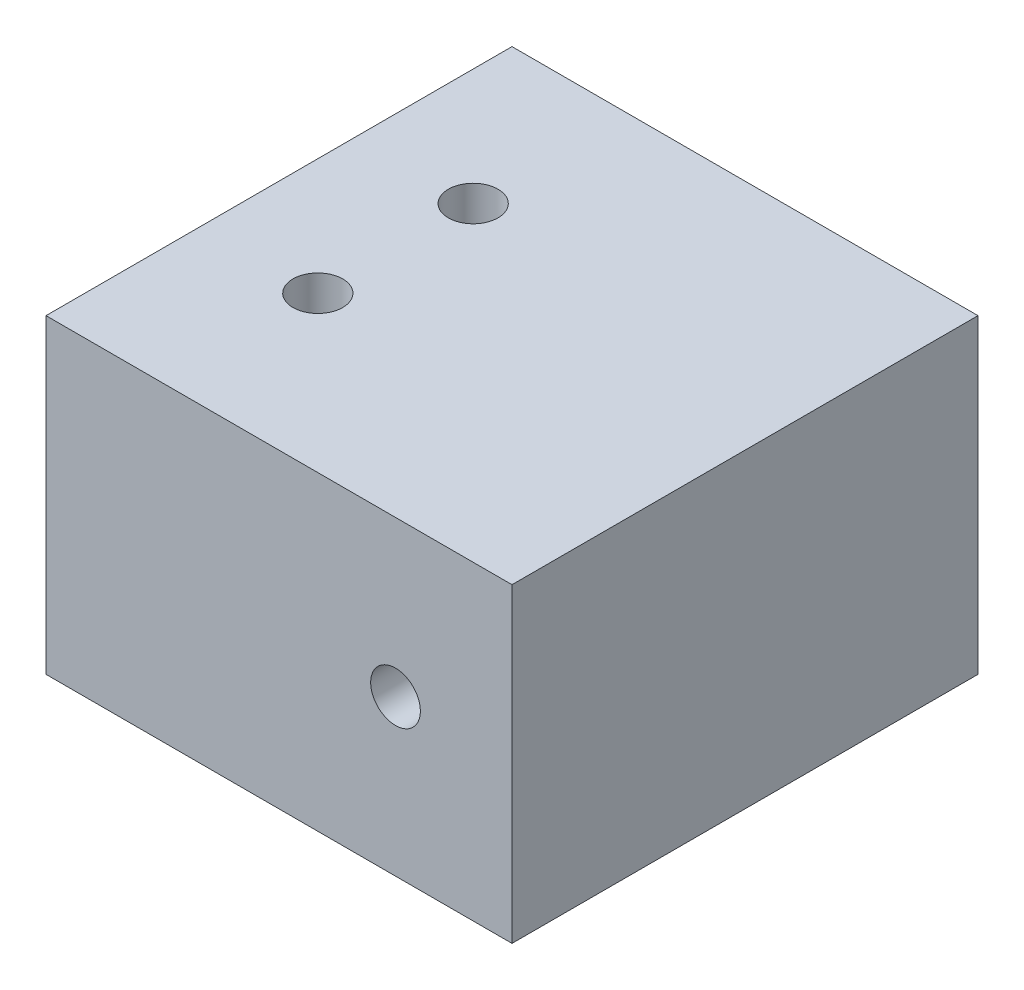
ISO-10303-21;
HEADER;
FILE_DESCRIPTION(('STEP AP214'),'2;1');
FILE_NAME('part.step','',(''),(''),'','','');
FILE_SCHEMA(('AUTOMOTIVE_DESIGN { 1 0 10303 214 1 1 1 1 }'));
ENDSEC;
DATA;
#1=APPLICATION_CONTEXT('core data for automotive mechanical design processes');
#2=APPLICATION_PROTOCOL_DEFINITION('international standard','automotive_design',2000,#1);
#3=PRODUCT_CONTEXT('',#1,'mechanical');
#4=PRODUCT('Part','Part','',(#3));
#5=PRODUCT_RELATED_PRODUCT_CATEGORY('part','',(#4));
#6=PRODUCT_DEFINITION_FORMATION('','',#4);
#7=PRODUCT_DEFINITION_CONTEXT('part definition',#1,'design');
#8=PRODUCT_DEFINITION('design','',#6,#7);
#9=PRODUCT_DEFINITION_SHAPE('','',#8);
#10=(LENGTH_UNIT() NAMED_UNIT(*) SI_UNIT(.MILLI.,.METRE.));
#11=(NAMED_UNIT(*) PLANE_ANGLE_UNIT() SI_UNIT($,.RADIAN.));
#12=(NAMED_UNIT(*) SI_UNIT($,.STERADIAN.) SOLID_ANGLE_UNIT());
#13=UNCERTAINTY_MEASURE_WITH_UNIT(LENGTH_MEASURE(1.E-05),#10,'distance_accuracy_value','');
#14=(GEOMETRIC_REPRESENTATION_CONTEXT(3) GLOBAL_UNCERTAINTY_ASSIGNED_CONTEXT((#13)) GLOBAL_UNIT_ASSIGNED_CONTEXT((#10,
#11,#12)) REPRESENTATION_CONTEXT('',''));
#15=CARTESIAN_POINT('',(0.,0.,0.));
#16=DIRECTION('',(0.,0.,1.));
#17=DIRECTION('',(1.,0.,0.));
#18=AXIS2_PLACEMENT_3D('',#15,#16,#17);
#19=CARTESIAN_POINT('',(0.,20.,0.));
#20=DIRECTION('',(0.,-1.,0.));
#21=DIRECTION('',(0.,0.,-1.));
#22=AXIS2_PLACEMENT_3D('',#19,#20,#21);
#23=PLANE('',#22);
#24=DIRECTION('',(0.,0.,1.));
#25=VECTOR('',#24,1.);
#26=CARTESIAN_POINT('',(0.,20.,0.));
#27=LINE('',#26,#25);
#28=CARTESIAN_POINT('',(0.,20.,-30.));
#29=VERTEX_POINT('',#28);
#30=CARTESIAN_POINT('',(0.,20.,0.));
#31=VERTEX_POINT('',#30);
#32=EDGE_CURVE('E93',#29,#31,#27,.T.);
#33=ORIENTED_EDGE('',*,*,#32,.T.);
#34=DIRECTION('',(1.,0.,0.));
#35=VECTOR('',#34,1.);
#36=CARTESIAN_POINT('',(0.,20.,0.));
#37=LINE('',#36,#35);
#38=CARTESIAN_POINT('',(30.,20.,0.));
#39=VERTEX_POINT('',#38);
#40=EDGE_CURVE('E88',#31,#39,#37,.T.);
#41=ORIENTED_EDGE('',*,*,#40,.T.);
#42=DIRECTION('',(0.,0.,-1.));
#43=VECTOR('',#42,1.);
#44=CARTESIAN_POINT('',(30.,20.,0.));
#45=LINE('',#44,#43);
#46=CARTESIAN_POINT('',(30.,20.,-30.));
#47=VERTEX_POINT('',#46);
#48=EDGE_CURVE('E91',#39,#47,#45,.T.);
#49=ORIENTED_EDGE('',*,*,#48,.T.);
#50=DIRECTION('',(-1.,0.,0.));
#51=VECTOR('',#50,1.);
#52=CARTESIAN_POINT('',(0.,20.,-30.));
#53=LINE('',#52,#51);
#54=EDGE_CURVE('E58',#47,#29,#53,.T.);
#55=ORIENTED_EDGE('',*,*,#54,.T.);
#56=EDGE_LOOP('',(#33,#41,#49,#55));
#57=FACE_BOUND('',#56,.T.);
#58=CARTESIAN_POINT('',(7.5,20.,-20.));
#59=DIRECTION('',(0.,1.,0.));
#60=DIRECTION('',(0.,0.,1.));
#61=AXIS2_PLACEMENT_3D('',#58,#59,#60);
#62=CIRCLE('',#61,1.6);
#63=CARTESIAN_POINT('',(7.5,20.,-18.4));
#64=VERTEX_POINT('',#63);
#65=EDGE_CURVE('E108',#64,#64,#62,.T.);
#66=ORIENTED_EDGE('',*,*,#65,.F.);
#67=EDGE_LOOP('',(#66));
#68=FACE_BOUND('',#67,.T.);
#69=CARTESIAN_POINT('',(7.5,20.,-10.));
#70=DIRECTION('',(0.,1.,0.));
#71=DIRECTION('',(0.,0.,1.));
#72=AXIS2_PLACEMENT_3D('',#69,#70,#71);
#73=CIRCLE('',#72,1.6);
#74=CARTESIAN_POINT('',(7.5,20.,-8.4));
#75=VERTEX_POINT('',#74);
#76=EDGE_CURVE('E123',#75,#75,#73,.T.);
#77=ORIENTED_EDGE('',*,*,#76,.F.);
#78=EDGE_LOOP('',(#77));
#79=FACE_BOUND('',#78,.T.);
#80=ADVANCED_FACE('F41',(#57,#68,#79),#23,.F.);
#81=CARTESIAN_POINT('',(0.,0.,0.));
#82=DIRECTION('',(0.,-1.,0.));
#83=DIRECTION('',(0.,0.,-1.));
#84=AXIS2_PLACEMENT_3D('',#81,#82,#83);
#85=PLANE('',#84);
#86=CARTESIAN_POINT('',(7.5,0.,-20.));
#87=DIRECTION('',(0.,1.,0.));
#88=DIRECTION('',(0.,0.,1.));
#89=AXIS2_PLACEMENT_3D('',#86,#87,#88);
#90=CIRCLE('',#89,1.6);
#91=CARTESIAN_POINT('',(7.5,0.,-18.4));
#92=VERTEX_POINT('',#91);
#93=EDGE_CURVE('E120',#92,#92,#90,.T.);
#94=ORIENTED_EDGE('',*,*,#93,.T.);
#95=EDGE_LOOP('',(#94));
#96=FACE_BOUND('',#95,.T.);
#97=DIRECTION('',(0.,0.,1.));
#98=VECTOR('',#97,1.);
#99=CARTESIAN_POINT('',(0.,0.,0.));
#100=LINE('',#99,#98);
#101=CARTESIAN_POINT('',(0.,0.,-30.));
#102=VERTEX_POINT('',#101);
#103=CARTESIAN_POINT('',(0.,0.,0.));
#104=VERTEX_POINT('',#103);
#105=EDGE_CURVE('E105',#102,#104,#100,.T.);
#106=ORIENTED_EDGE('',*,*,#105,.F.);
#107=DIRECTION('',(-1.,0.,0.));
#108=VECTOR('',#107,1.);
#109=CARTESIAN_POINT('',(0.,0.,-30.));
#110=LINE('',#109,#108);
#111=CARTESIAN_POINT('',(30.,0.,-30.));
#112=VERTEX_POINT('',#111);
#113=EDGE_CURVE('E81',#112,#102,#110,.T.);
#114=ORIENTED_EDGE('',*,*,#113,.F.);
#115=DIRECTION('',(0.,0.,-1.));
#116=VECTOR('',#115,1.);
#117=CARTESIAN_POINT('',(30.,0.,0.));
#118=LINE('',#117,#116);
#119=CARTESIAN_POINT('',(30.,0.,0.));
#120=VERTEX_POINT('',#119);
#121=EDGE_CURVE('E75',#120,#112,#118,.T.);
#122=ORIENTED_EDGE('',*,*,#121,.F.);
#123=DIRECTION('',(1.,0.,0.));
#124=VECTOR('',#123,1.);
#125=CARTESIAN_POINT('',(0.,0.,0.));
#126=LINE('',#125,#124);
#127=EDGE_CURVE('E97',#104,#120,#126,.T.);
#128=ORIENTED_EDGE('',*,*,#127,.F.);
#129=EDGE_LOOP('',(#106,#114,#122,#128));
#130=FACE_BOUND('',#129,.T.);
#131=CARTESIAN_POINT('',(7.5,0.,-10.));
#132=DIRECTION('',(0.,1.,0.));
#133=DIRECTION('',(0.,0.,1.));
#134=AXIS2_PLACEMENT_3D('',#131,#132,#133);
#135=CIRCLE('',#134,1.6);
#136=CARTESIAN_POINT('',(7.5,0.,-8.4));
#137=VERTEX_POINT('',#136);
#138=EDGE_CURVE('E126',#137,#137,#135,.T.);
#139=ORIENTED_EDGE('',*,*,#138,.T.);
#140=EDGE_LOOP('',(#139));
#141=FACE_BOUND('',#140,.T.);
#142=ADVANCED_FACE('F116',(#96,#130,#141),#85,.T.);
#143=CARTESIAN_POINT('',(0.,20.,0.));
#144=DIRECTION('',(1.,0.,0.));
#145=DIRECTION('',(0.,0.,-1.));
#146=AXIS2_PLACEMENT_3D('',#143,#144,#145);
#147=PLANE('',#146);
#148=ORIENTED_EDGE('',*,*,#105,.T.);
#149=DIRECTION('',(0.,-1.,0.));
#150=VECTOR('',#149,1.);
#151=CARTESIAN_POINT('',(0.,20.,0.));
#152=LINE('',#151,#150);
#153=EDGE_CURVE('E11',#31,#104,#152,.T.);
#154=ORIENTED_EDGE('',*,*,#153,.F.);
#155=ORIENTED_EDGE('',*,*,#32,.F.);
#156=DIRECTION('',(0.,-1.,0.));
#157=VECTOR('',#156,1.);
#158=CARTESIAN_POINT('',(0.,20.,-30.));
#159=LINE('',#158,#157);
#160=EDGE_CURVE('E101',#29,#102,#159,.T.);
#161=ORIENTED_EDGE('',*,*,#160,.T.);
#162=EDGE_LOOP('',(#148,#154,#155,#161));
#163=FACE_BOUND('',#162,.T.);
#164=ADVANCED_FACE('F43',(#163),#147,.F.);
#165=CARTESIAN_POINT('',(0.,20.,0.));
#166=DIRECTION('',(0.,0.,-1.));
#167=DIRECTION('',(-1.,0.,0.));
#168=AXIS2_PLACEMENT_3D('',#165,#166,#167);
#169=PLANE('',#168);
#170=CARTESIAN_POINT('',(22.5,10.,0.));
#171=DIRECTION('',(0.,0.,-1.));
#172=DIRECTION('',(-1.,0.,0.));
#173=AXIS2_PLACEMENT_3D('',#170,#171,#172);
#174=CIRCLE('',#173,1.6);
#175=CARTESIAN_POINT('',(20.9,10.,0.));
#176=VERTEX_POINT('',#175);
#177=EDGE_CURVE('E129',#176,#176,#174,.T.);
#178=ORIENTED_EDGE('',*,*,#177,.T.);
#179=EDGE_LOOP('',(#178));
#180=FACE_BOUND('',#179,.T.);
#181=ORIENTED_EDGE('',*,*,#127,.T.);
#182=DIRECTION('',(0.,-1.,0.));
#183=VECTOR('',#182,1.);
#184=CARTESIAN_POINT('',(30.,20.,0.));
#185=LINE('',#184,#183);
#186=EDGE_CURVE('E50',#39,#120,#185,.T.);
#187=ORIENTED_EDGE('',*,*,#186,.F.);
#188=ORIENTED_EDGE('',*,*,#40,.F.);
#189=ORIENTED_EDGE('',*,*,#153,.T.);
#190=EDGE_LOOP('',(#181,#187,#188,#189));
#191=FACE_BOUND('',#190,.T.);
#192=ADVANCED_FACE('F96',(#180,#191),#169,.F.);
#193=CARTESIAN_POINT('',(30.,20.,0.));
#194=DIRECTION('',(-1.,0.,0.));
#195=DIRECTION('',(0.,0.,1.));
#196=AXIS2_PLACEMENT_3D('',#193,#194,#195);
#197=PLANE('',#196);
#198=ORIENTED_EDGE('',*,*,#121,.T.);
#199=DIRECTION('',(0.,-1.,0.));
#200=VECTOR('',#199,1.);
#201=CARTESIAN_POINT('',(30.,20.,-30.));
#202=LINE('',#201,#200);
#203=EDGE_CURVE('E98',#47,#112,#202,.T.);
#204=ORIENTED_EDGE('',*,*,#203,.F.);
#205=ORIENTED_EDGE('',*,*,#48,.F.);
#206=ORIENTED_EDGE('',*,*,#186,.T.);
#207=EDGE_LOOP('',(#198,#204,#205,#206));
#208=FACE_BOUND('',#207,.T.);
#209=ADVANCED_FACE('F99',(#208),#197,.F.);
#210=CARTESIAN_POINT('',(0.,20.,-30.));
#211=DIRECTION('',(0.,0.,1.));
#212=DIRECTION('',(1.,0.,0.));
#213=AXIS2_PLACEMENT_3D('',#210,#211,#212);
#214=PLANE('',#213);
#215=CARTESIAN_POINT('',(22.5,10.,-30.));
#216=DIRECTION('',(0.,0.,-1.));
#217=DIRECTION('',(-1.,0.,0.));
#218=AXIS2_PLACEMENT_3D('',#215,#216,#217);
#219=CIRCLE('',#218,1.6);
#220=CARTESIAN_POINT('',(20.9,10.,-30.));
#221=VERTEX_POINT('',#220);
#222=EDGE_CURVE('E132',#221,#221,#219,.T.);
#223=ORIENTED_EDGE('',*,*,#222,.F.);
#224=EDGE_LOOP('',(#223));
#225=FACE_BOUND('',#224,.T.);
#226=ORIENTED_EDGE('',*,*,#113,.T.);
#227=ORIENTED_EDGE('',*,*,#160,.F.);
#228=ORIENTED_EDGE('',*,*,#54,.F.);
#229=ORIENTED_EDGE('',*,*,#203,.T.);
#230=EDGE_LOOP('',(#226,#227,#228,#229));
#231=FACE_BOUND('',#230,.T.);
#232=ADVANCED_FACE('F113',(#225,#231),#214,.F.);
#233=CARTESIAN_POINT('',(7.5,20.,-20.));
#234=DIRECTION('',(0.,-1.,0.));
#235=DIRECTION('',(0.,0.,-1.));
#236=AXIS2_PLACEMENT_3D('',#233,#234,#235);
#237=CYLINDRICAL_SURFACE('',#236,1.6);
#238=ORIENTED_EDGE('',*,*,#65,.T.);
#239=EDGE_LOOP('',(#238));
#240=FACE_BOUND('',#239,.T.);
#241=ORIENTED_EDGE('',*,*,#93,.F.);
#242=EDGE_LOOP('',(#241));
#243=FACE_BOUND('',#242,.T.);
#244=ADVANCED_FACE('F147',(#240,#243),#237,.F.);
#245=CARTESIAN_POINT('',(7.5,20.,-10.));
#246=DIRECTION('',(0.,-1.,0.));
#247=DIRECTION('',(0.,0.,-1.));
#248=AXIS2_PLACEMENT_3D('',#245,#246,#247);
#249=CYLINDRICAL_SURFACE('',#248,1.6);
#250=ORIENTED_EDGE('',*,*,#76,.T.);
#251=EDGE_LOOP('',(#250));
#252=FACE_BOUND('',#251,.T.);
#253=ORIENTED_EDGE('',*,*,#138,.F.);
#254=EDGE_LOOP('',(#253));
#255=FACE_BOUND('',#254,.T.);
#256=ADVANCED_FACE('F142',(#252,#255),#249,.F.);
#257=CARTESIAN_POINT('',(22.5,10.,0.));
#258=DIRECTION('',(0.,0.,-1.));
#259=DIRECTION('',(-1.,0.,0.));
#260=AXIS2_PLACEMENT_3D('',#257,#258,#259);
#261=CYLINDRICAL_SURFACE('',#260,1.6);
#262=ORIENTED_EDGE('',*,*,#177,.F.);
#263=EDGE_LOOP('',(#262));
#264=FACE_BOUND('',#263,.T.);
#265=ORIENTED_EDGE('',*,*,#222,.T.);
#266=EDGE_LOOP('',(#265));
#267=FACE_BOUND('',#266,.T.);
#268=ADVANCED_FACE('F139',(#264,#267),#261,.F.);
#269=CLOSED_SHELL('',(#80,#142,#164,#192,#209,#232,#244,#256,#268));
#270=MANIFOLD_SOLID_BREP('B2',#269);
#271=ADVANCED_BREP_SHAPE_REPRESENTATION('',(#18,#270),#14);
#272=SHAPE_DEFINITION_REPRESENTATION(#9,#271);
ENDSEC;
END-ISO-10303-21;
